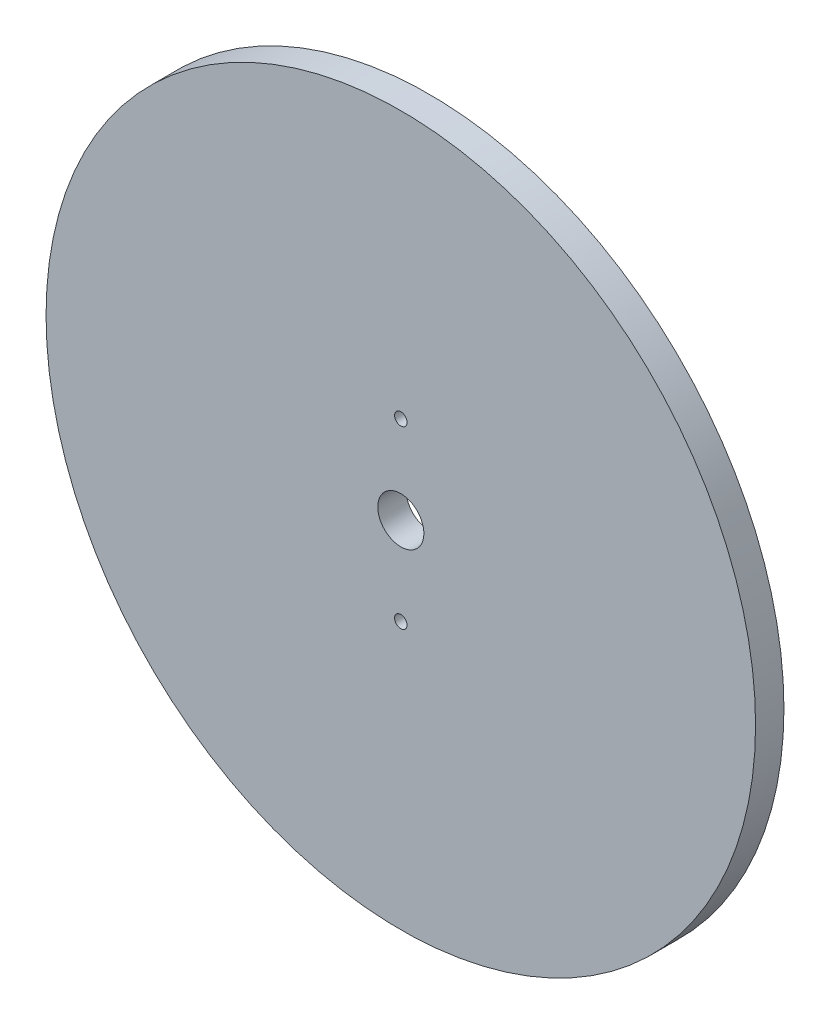
ISO-10303-21;
HEADER;
FILE_DESCRIPTION(('STEP AP214'),'2;1');
FILE_NAME('part.step','',(''),(''),'','','');
FILE_SCHEMA(('AUTOMOTIVE_DESIGN { 1 0 10303 214 1 1 1 1 }'));
ENDSEC;
DATA;
#1=APPLICATION_CONTEXT('core data for automotive mechanical design processes');
#2=APPLICATION_PROTOCOL_DEFINITION('international standard','automotive_design',2000,#1);
#3=PRODUCT_CONTEXT('',#1,'mechanical');
#4=PRODUCT('Part','Part','',(#3));
#5=PRODUCT_RELATED_PRODUCT_CATEGORY('part','',(#4));
#6=PRODUCT_DEFINITION_FORMATION('','',#4);
#7=PRODUCT_DEFINITION_CONTEXT('part definition',#1,'design');
#8=PRODUCT_DEFINITION('design','',#6,#7);
#9=PRODUCT_DEFINITION_SHAPE('','',#8);
#10=(LENGTH_UNIT() NAMED_UNIT(*) SI_UNIT(.MILLI.,.METRE.));
#11=(NAMED_UNIT(*) PLANE_ANGLE_UNIT() SI_UNIT($,.RADIAN.));
#12=(NAMED_UNIT(*) SI_UNIT($,.STERADIAN.) SOLID_ANGLE_UNIT());
#13=UNCERTAINTY_MEASURE_WITH_UNIT(LENGTH_MEASURE(1.E-05),#10,'distance_accuracy_value','');
#14=(GEOMETRIC_REPRESENTATION_CONTEXT(3) GLOBAL_UNCERTAINTY_ASSIGNED_CONTEXT((#13)) GLOBAL_UNIT_ASSIGNED_CONTEXT((#10,
#11,#12)) REPRESENTATION_CONTEXT('',''));
#15=CARTESIAN_POINT('',(0.,0.,0.));
#16=DIRECTION('',(0.,0.,1.));
#17=DIRECTION('',(1.,0.,0.));
#18=AXIS2_PLACEMENT_3D('',#15,#16,#17);
#19=CARTESIAN_POINT('',(0.,0.,8.));
#20=DIRECTION('',(0.,0.,-1.));
#21=DIRECTION('',(-1.,0.,0.));
#22=AXIS2_PLACEMENT_3D('',#19,#20,#21);
#23=CYLINDRICAL_SURFACE('',#22,100.);
#24=CARTESIAN_POINT('',(0.,0.,8.));
#25=DIRECTION('',(0.,0.,1.));
#26=DIRECTION('',(1.,0.,0.));
#27=AXIS2_PLACEMENT_3D('',#24,#25,#26);
#28=CIRCLE('',#27,100.);
#29=CARTESIAN_POINT('',(100.,0.,8.));
#30=VERTEX_POINT('',#29);
#31=EDGE_CURVE('E10',#30,#30,#28,.T.);
#32=ORIENTED_EDGE('',*,*,#31,.F.);
#33=EDGE_LOOP('',(#32));
#34=FACE_BOUND('',#33,.T.);
#35=CARTESIAN_POINT('',(0.,0.,0.));
#36=DIRECTION('',(0.,0.,1.));
#37=DIRECTION('',(1.,0.,0.));
#38=AXIS2_PLACEMENT_3D('',#35,#36,#37);
#39=CIRCLE('',#38,100.);
#40=CARTESIAN_POINT('',(100.,0.,0.));
#41=VERTEX_POINT('',#40);
#42=EDGE_CURVE('E46',#41,#41,#39,.T.);
#43=ORIENTED_EDGE('',*,*,#42,.T.);
#44=EDGE_LOOP('',(#43));
#45=FACE_BOUND('',#44,.T.);
#46=ADVANCED_FACE('F43',(#34,#45),#23,.T.);
#47=CARTESIAN_POINT('',(0.,0.,8.));
#48=DIRECTION('',(0.,0.,1.));
#49=DIRECTION('',(1.,0.,0.));
#50=AXIS2_PLACEMENT_3D('',#47,#48,#49);
#51=PLANE('',#50);
#52=CARTESIAN_POINT('',(0.,24.75,8.));
#53=DIRECTION('',(0.,0.,1.));
#54=DIRECTION('',(1.,0.,0.));
#55=AXIS2_PLACEMENT_3D('',#52,#53,#54);
#56=CIRCLE('',#55,1.75);
#57=CARTESIAN_POINT('',(1.75,24.75,8.));
#58=VERTEX_POINT('',#57);
#59=EDGE_CURVE('E54',#58,#58,#56,.F.);
#60=ORIENTED_EDGE('',*,*,#59,.T.);
#61=EDGE_LOOP('',(#60));
#62=FACE_BOUND('',#61,.T.);
#63=CARTESIAN_POINT('',(0.,-24.75,8.));
#64=DIRECTION('',(0.,0.,1.));
#65=DIRECTION('',(1.,0.,0.));
#66=AXIS2_PLACEMENT_3D('',#63,#64,#65);
#67=CIRCLE('',#66,1.75);
#68=CARTESIAN_POINT('',(1.75,-24.75,8.));
#69=VERTEX_POINT('',#68);
#70=EDGE_CURVE('E58',#69,#69,#67,.F.);
#71=ORIENTED_EDGE('',*,*,#70,.T.);
#72=EDGE_LOOP('',(#71));
#73=FACE_BOUND('',#72,.T.);
#74=CARTESIAN_POINT('',(0.,0.,8.));
#75=DIRECTION('',(0.,0.,1.));
#76=DIRECTION('',(1.,0.,0.));
#77=AXIS2_PLACEMENT_3D('',#74,#75,#76);
#78=CIRCLE('',#77,6.5);
#79=CARTESIAN_POINT('',(6.5,0.,8.));
#80=VERTEX_POINT('',#79);
#81=EDGE_CURVE('E61',#80,#80,#78,.F.);
#82=ORIENTED_EDGE('',*,*,#81,.T.);
#83=EDGE_LOOP('',(#82));
#84=FACE_BOUND('',#83,.T.);
#85=ORIENTED_EDGE('',*,*,#31,.T.);
#86=EDGE_LOOP('',(#85));
#87=FACE_BOUND('',#86,.T.);
#88=ADVANCED_FACE('F100',(#62,#73,#84,#87),#51,.T.);
#89=CARTESIAN_POINT('',(0.,0.,0.));
#90=DIRECTION('',(0.,0.,1.));
#91=DIRECTION('',(1.,0.,0.));
#92=AXIS2_PLACEMENT_3D('',#89,#90,#91);
#93=PLANE('',#92);
#94=CARTESIAN_POINT('',(0.,24.75,0.));
#95=DIRECTION('',(0.,0.,1.));
#96=DIRECTION('',(1.,0.,0.));
#97=AXIS2_PLACEMENT_3D('',#94,#95,#96);
#98=CIRCLE('',#97,1.75);
#99=CARTESIAN_POINT('',(1.75,24.75,0.));
#100=VERTEX_POINT('',#99);
#101=EDGE_CURVE('E70',#100,#100,#98,.T.);
#102=ORIENTED_EDGE('',*,*,#101,.T.);
#103=EDGE_LOOP('',(#102));
#104=FACE_BOUND('',#103,.T.);
#105=CARTESIAN_POINT('',(0.,-24.75,0.));
#106=DIRECTION('',(0.,0.,1.));
#107=DIRECTION('',(1.,0.,0.));
#108=AXIS2_PLACEMENT_3D('',#105,#106,#107);
#109=CIRCLE('',#108,1.75);
#110=CARTESIAN_POINT('',(1.75,-24.75,0.));
#111=VERTEX_POINT('',#110);
#112=EDGE_CURVE('E71',#111,#111,#109,.T.);
#113=ORIENTED_EDGE('',*,*,#112,.T.);
#114=EDGE_LOOP('',(#113));
#115=FACE_BOUND('',#114,.T.);
#116=CARTESIAN_POINT('',(0.,0.,0.));
#117=DIRECTION('',(0.,0.,1.));
#118=DIRECTION('',(1.,0.,0.));
#119=AXIS2_PLACEMENT_3D('',#116,#117,#118);
#120=CIRCLE('',#119,6.5);
#121=CARTESIAN_POINT('',(6.5,0.,0.));
#122=VERTEX_POINT('',#121);
#123=EDGE_CURVE('E68',#122,#122,#120,.T.);
#124=ORIENTED_EDGE('',*,*,#123,.T.);
#125=EDGE_LOOP('',(#124));
#126=FACE_BOUND('',#125,.T.);
#127=ORIENTED_EDGE('',*,*,#42,.F.);
#128=EDGE_LOOP('',(#127));
#129=FACE_BOUND('',#128,.T.);
#130=ADVANCED_FACE('F84',(#104,#115,#126,#129),#93,.F.);
#131=CARTESIAN_POINT('',(0.,0.,9.));
#132=DIRECTION('',(0.,0.,-1.));
#133=DIRECTION('',(-1.,0.,0.));
#134=AXIS2_PLACEMENT_3D('',#131,#132,#133);
#135=CYLINDRICAL_SURFACE('',#134,6.5);
#136=ORIENTED_EDGE('',*,*,#81,.F.);
#137=EDGE_LOOP('',(#136));
#138=FACE_BOUND('',#137,.T.);
#139=ORIENTED_EDGE('',*,*,#123,.F.);
#140=EDGE_LOOP('',(#139));
#141=FACE_BOUND('',#140,.T.);
#142=ADVANCED_FACE('F95',(#138,#141),#135,.F.);
#143=CARTESIAN_POINT('',(0.,-24.75,9.));
#144=DIRECTION('',(0.,0.,-1.));
#145=DIRECTION('',(-1.,0.,0.));
#146=AXIS2_PLACEMENT_3D('',#143,#144,#145);
#147=CYLINDRICAL_SURFACE('',#146,1.75);
#148=ORIENTED_EDGE('',*,*,#70,.F.);
#149=EDGE_LOOP('',(#148));
#150=FACE_BOUND('',#149,.T.);
#151=ORIENTED_EDGE('',*,*,#112,.F.);
#152=EDGE_LOOP('',(#151));
#153=FACE_BOUND('',#152,.T.);
#154=ADVANCED_FACE('F88',(#150,#153),#147,.F.);
#155=CARTESIAN_POINT('',(0.,24.75,9.));
#156=DIRECTION('',(0.,0.,-1.));
#157=DIRECTION('',(-1.,0.,0.));
#158=AXIS2_PLACEMENT_3D('',#155,#156,#157);
#159=CYLINDRICAL_SURFACE('',#158,1.75);
#160=ORIENTED_EDGE('',*,*,#59,.F.);
#161=EDGE_LOOP('',(#160));
#162=FACE_BOUND('',#161,.T.);
#163=ORIENTED_EDGE('',*,*,#101,.F.);
#164=EDGE_LOOP('',(#163));
#165=FACE_BOUND('',#164,.T.);
#166=ADVANCED_FACE('F83',(#162,#165),#159,.F.);
#167=CLOSED_SHELL('',(#46,#88,#130,#142,#154,#166));
#168=MANIFOLD_SOLID_BREP('B2',#167);
#169=ADVANCED_BREP_SHAPE_REPRESENTATION('',(#18,#168),#14);
#170=SHAPE_DEFINITION_REPRESENTATION(#9,#169);
ENDSEC;
END-ISO-10303-21;
